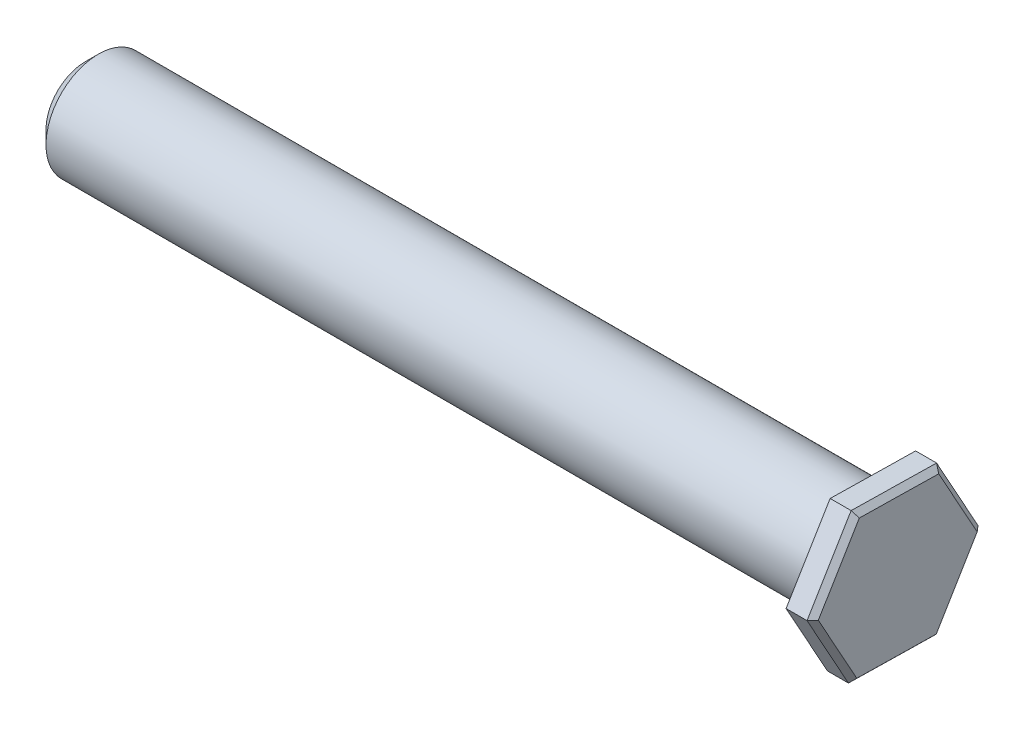
ISO-10303-21;
HEADER;
FILE_DESCRIPTION(('STEP AP214'),'2;1');
FILE_NAME('part.step','',(''),(''),'','','');
FILE_SCHEMA(('AUTOMOTIVE_DESIGN { 1 0 10303 214 1 1 1 1 }'));
ENDSEC;
DATA;
#1=APPLICATION_CONTEXT('core data for automotive mechanical design processes');
#2=APPLICATION_PROTOCOL_DEFINITION('international standard','automotive_design',2000,#1);
#3=PRODUCT_CONTEXT('',#1,'mechanical');
#4=PRODUCT('Part','Part','',(#3));
#5=PRODUCT_RELATED_PRODUCT_CATEGORY('part','',(#4));
#6=PRODUCT_DEFINITION_FORMATION('','',#4);
#7=PRODUCT_DEFINITION_CONTEXT('part definition',#1,'design');
#8=PRODUCT_DEFINITION('design','',#6,#7);
#9=PRODUCT_DEFINITION_SHAPE('','',#8);
#10=(LENGTH_UNIT() NAMED_UNIT(*) SI_UNIT(.MILLI.,.METRE.));
#11=(NAMED_UNIT(*) PLANE_ANGLE_UNIT() SI_UNIT($,.RADIAN.));
#12=(NAMED_UNIT(*) SI_UNIT($,.STERADIAN.) SOLID_ANGLE_UNIT());
#13=UNCERTAINTY_MEASURE_WITH_UNIT(LENGTH_MEASURE(1.E-05),#10,'distance_accuracy_value','');
#14=(GEOMETRIC_REPRESENTATION_CONTEXT(3) GLOBAL_UNCERTAINTY_ASSIGNED_CONTEXT((#13)) GLOBAL_UNIT_ASSIGNED_CONTEXT((#10,
#11,#12)) REPRESENTATION_CONTEXT('',''));
#15=CARTESIAN_POINT('',(0.,0.,0.));
#16=DIRECTION('',(0.,0.,1.));
#17=DIRECTION('',(1.,0.,0.));
#18=AXIS2_PLACEMENT_3D('',#15,#16,#17);
#19=CARTESIAN_POINT('',(150.,0.,0.));
#20=DIRECTION('',(-1.,0.,0.));
#21=DIRECTION('',(0.,0.,1.));
#22=AXIS2_PLACEMENT_3D('',#19,#20,#21);
#23=CYLINDRICAL_SURFACE('',#22,10.);
#24=CARTESIAN_POINT('',(2.50000000000003,0.,0.));
#25=DIRECTION('',(1.,0.,0.));
#26=DIRECTION('',(0.,0.,-1.));
#27=AXIS2_PLACEMENT_3D('',#24,#25,#26);
#28=CIRCLE('',#27,10.);
#29=CARTESIAN_POINT('',(2.50000000000003,0.,-10.));
#30=VERTEX_POINT('',#29);
#31=EDGE_CURVE('E45',#30,#30,#28,.T.);
#32=ORIENTED_EDGE('',*,*,#31,.T.);
#33=EDGE_LOOP('',(#32));
#34=FACE_BOUND('',#33,.T.);
#35=CARTESIAN_POINT('',(150.,0.,0.));
#36=DIRECTION('',(1.,0.,0.));
#37=DIRECTION('',(0.,0.,-1.));
#38=AXIS2_PLACEMENT_3D('',#35,#36,#37);
#39=CIRCLE('',#38,10.);
#40=CARTESIAN_POINT('',(150.,0.,-10.));
#41=VERTEX_POINT('',#40);
#42=EDGE_CURVE('E115',#41,#41,#39,.T.);
#43=ORIENTED_EDGE('',*,*,#42,.F.);
#44=EDGE_LOOP('',(#43));
#45=FACE_BOUND('',#44,.T.);
#46=ADVANCED_FACE('F37',(#34,#45),#23,.T.);
#47=CARTESIAN_POINT('',(0.,0.,0.));
#48=DIRECTION('',(1.,0.,0.));
#49=DIRECTION('',(0.,0.,-1.));
#50=AXIS2_PLACEMENT_3D('',#47,#48,#49);
#51=PLANE('',#50);
#52=CARTESIAN_POINT('',(0.,0.,0.));
#53=DIRECTION('',(1.,0.,0.));
#54=DIRECTION('',(0.,0.,-1.));
#55=AXIS2_PLACEMENT_3D('',#52,#53,#54);
#56=CIRCLE('',#55,7.49999999999998);
#57=CARTESIAN_POINT('',(0.,0.,-7.49999999999998));
#58=VERTEX_POINT('',#57);
#59=EDGE_CURVE('E11',#58,#58,#56,.F.);
#60=ORIENTED_EDGE('',*,*,#59,.T.);
#61=EDGE_LOOP('',(#60));
#62=FACE_BOUND('',#61,.T.);
#63=ADVANCED_FACE('F207',(#62),#51,.F.);
#64=CARTESIAN_POINT('',(155.,14.271842173842,7.8973524301262));
#65=DIRECTION('',(0.,-0.51566572756256,-0.856789856042528));
#66=DIRECTION('',(0.,0.856789856042528,-0.51566572756256));
#67=AXIS2_PLACEMENT_3D('',#64,#65,#66);
#68=PLANE('',#67);
#69=DIRECTION('',(-1.,0.,0.));
#70=VECTOR('',#69,1.);
#71=CARTESIAN_POINT('',(155.,0.296613259792956,16.3084540964124));
#72=LINE('',#71,#70);
#73=CARTESIAN_POINT('',(154.,0.296613259792956,16.3084540964124));
#74=VERTEX_POINT('',#73);
#75=CARTESIAN_POINT('',(150.,0.296613259792956,16.3084540964124));
#76=VERTEX_POINT('',#75);
#77=EDGE_CURVE('E107',#74,#76,#72,.T.);
#78=ORIENTED_EDGE('',*,*,#77,.F.);
#79=DIRECTION('',(0.,0.856789856042528,-0.51566572756256));
#80=VECTOR('',#79,1.);
#81=CARTESIAN_POINT('',(154.,14.271842173842,7.8973524301262));
#82=LINE('',#81,#80);
#83=CARTESIAN_POINT('',(154.,14.271842173842,7.8973524301262));
#84=VERTEX_POINT('',#83);
#85=EDGE_CURVE('E178',#74,#84,#82,.T.);
#86=ORIENTED_EDGE('',*,*,#85,.T.);
#87=DIRECTION('',(-1.,0.,0.));
#88=VECTOR('',#87,1.);
#89=CARTESIAN_POINT('',(155.,14.271842173842,7.8973524301262));
#90=LINE('',#89,#88);
#91=CARTESIAN_POINT('',(150.,14.271842173842,7.8973524301262));
#92=VERTEX_POINT('',#91);
#93=EDGE_CURVE('E129',#84,#92,#90,.T.);
#94=ORIENTED_EDGE('',*,*,#93,.T.);
#95=DIRECTION('',(0.,-0.856789856042528,0.51566572756256));
#96=VECTOR('',#95,1.);
#97=CARTESIAN_POINT('',(150.,14.271842173842,7.8973524301262));
#98=LINE('',#97,#96);
#99=EDGE_CURVE('E122',#92,#76,#98,.T.);
#100=ORIENTED_EDGE('',*,*,#99,.T.);
#101=EDGE_LOOP('',(#78,#86,#94,#100));
#102=FACE_BOUND('',#101,.T.);
#103=ADVANCED_FACE('F127',(#102),#68,.F.);
#104=CARTESIAN_POINT('',(155.,0.296613259792956,16.3084540964124));
#105=DIRECTION('',(0.,0.484168917256361,-0.874974547951426));
#106=DIRECTION('',(0.,0.874974547951426,0.484168917256361));
#107=AXIS2_PLACEMENT_3D('',#104,#105,#106);
#108=PLANE('',#107);
#109=DIRECTION('',(-1.,0.,0.));
#110=VECTOR('',#109,1.);
#111=CARTESIAN_POINT('',(155.,-13.9752289140491,8.41110166628622));
#112=LINE('',#111,#110);
#113=CARTESIAN_POINT('',(154.,-13.9752289140491,8.41110166628622));
#114=VERTEX_POINT('',#113);
#115=CARTESIAN_POINT('',(150.,-13.9752289140491,8.41110166628622));
#116=VERTEX_POINT('',#115);
#117=EDGE_CURVE('E116',#114,#116,#112,.T.);
#118=ORIENTED_EDGE('',*,*,#117,.F.);
#119=DIRECTION('',(0.,0.874974547951426,0.484168917256361));
#120=VECTOR('',#119,1.);
#121=CARTESIAN_POINT('',(154.,0.296613259792956,16.3084540964124));
#122=LINE('',#121,#120);
#123=EDGE_CURVE('E52',#114,#74,#122,.T.);
#124=ORIENTED_EDGE('',*,*,#123,.T.);
#125=ORIENTED_EDGE('',*,*,#77,.T.);
#126=DIRECTION('',(0.,-0.874974547951426,-0.484168917256361));
#127=VECTOR('',#126,1.);
#128=CARTESIAN_POINT('',(150.,0.296613259792956,16.3084540964124));
#129=LINE('',#128,#127);
#130=EDGE_CURVE('E110',#76,#116,#129,.T.);
#131=ORIENTED_EDGE('',*,*,#130,.T.);
#132=EDGE_LOOP('',(#118,#124,#125,#131));
#133=FACE_BOUND('',#132,.T.);
#134=ADVANCED_FACE('F109',(#133),#108,.F.);
#135=CARTESIAN_POINT('',(155.,-13.9752289140491,8.41110166628622));
#136=DIRECTION('',(0.,0.999834644818921,-0.0181846919088983));
#137=DIRECTION('',(0.,0.0181846919088983,0.999834644818921));
#138=AXIS2_PLACEMENT_3D('',#135,#136,#137);
#139=PLANE('',#138);
#140=DIRECTION('',(-1.,0.,0.));
#141=VECTOR('',#140,1.);
#142=CARTESIAN_POINT('',(155.,-14.271842173842,-7.89735243012619));
#143=LINE('',#142,#141);
#144=CARTESIAN_POINT('',(154.,-14.271842173842,-7.89735243012619));
#145=VERTEX_POINT('',#144);
#146=CARTESIAN_POINT('',(150.,-14.271842173842,-7.89735243012619));
#147=VERTEX_POINT('',#146);
#148=EDGE_CURVE('E151',#145,#147,#143,.T.);
#149=ORIENTED_EDGE('',*,*,#148,.F.);
#150=DIRECTION('',(0.,0.0181846919088983,0.999834644818921));
#151=VECTOR('',#150,1.);
#152=CARTESIAN_POINT('',(154.,-13.9752289140491,8.41110166628622));
#153=LINE('',#152,#151);
#154=EDGE_CURVE('E60',#145,#114,#153,.T.);
#155=ORIENTED_EDGE('',*,*,#154,.T.);
#156=ORIENTED_EDGE('',*,*,#117,.T.);
#157=DIRECTION('',(0.,-0.0181846919088983,-0.999834644818921));
#158=VECTOR('',#157,1.);
#159=CARTESIAN_POINT('',(150.,-13.9752289140491,8.41110166628622));
#160=LINE('',#159,#158);
#161=EDGE_CURVE('E125',#116,#147,#160,.T.);
#162=ORIENTED_EDGE('',*,*,#161,.T.);
#163=EDGE_LOOP('',(#149,#155,#156,#162));
#164=FACE_BOUND('',#163,.T.);
#165=ADVANCED_FACE('F275',(#164),#139,.F.);
#166=CARTESIAN_POINT('',(155.,-14.271842173842,-7.89735243012619));
#167=DIRECTION('',(0.,0.51566572756256,0.856789856042528));
#168=DIRECTION('',(0.,-0.856789856042528,0.51566572756256));
#169=AXIS2_PLACEMENT_3D('',#166,#167,#168);
#170=PLANE('',#169);
#171=DIRECTION('',(-1.,0.,0.));
#172=VECTOR('',#171,1.);
#173=CARTESIAN_POINT('',(155.,-0.296613259792948,-16.3084540964124));
#174=LINE('',#173,#172);
#175=CARTESIAN_POINT('',(154.,-0.296613259792948,-16.3084540964124));
#176=VERTEX_POINT('',#175);
#177=CARTESIAN_POINT('',(150.,-0.296613259792948,-16.3084540964124));
#178=VERTEX_POINT('',#177);
#179=EDGE_CURVE('E149',#176,#178,#174,.T.);
#180=ORIENTED_EDGE('',*,*,#179,.F.);
#181=DIRECTION('',(0.,-0.856789856042528,0.51566572756256));
#182=VECTOR('',#181,1.);
#183=CARTESIAN_POINT('',(154.,-14.271842173842,-7.89735243012619));
#184=LINE('',#183,#182);
#185=EDGE_CURVE('E174',#176,#145,#184,.T.);
#186=ORIENTED_EDGE('',*,*,#185,.T.);
#187=ORIENTED_EDGE('',*,*,#148,.T.);
#188=DIRECTION('',(0.,0.856789856042528,-0.51566572756256));
#189=VECTOR('',#188,1.);
#190=CARTESIAN_POINT('',(150.,-14.271842173842,-7.89735243012619));
#191=LINE('',#190,#189);
#192=EDGE_CURVE('E138',#147,#178,#191,.T.);
#193=ORIENTED_EDGE('',*,*,#192,.T.);
#194=EDGE_LOOP('',(#180,#186,#187,#193));
#195=FACE_BOUND('',#194,.T.);
#196=ADVANCED_FACE('F260',(#195),#170,.F.);
#197=CARTESIAN_POINT('',(155.,-0.296613259792948,-16.3084540964124));
#198=DIRECTION('',(0.,-0.484168917256362,0.874974547951426));
#199=DIRECTION('',(0.,-0.874974547951426,-0.484168917256362));
#200=AXIS2_PLACEMENT_3D('',#197,#198,#199);
#201=PLANE('',#200);
#202=DIRECTION('',(-1.,0.,0.));
#203=VECTOR('',#202,1.);
#204=CARTESIAN_POINT('',(155.,13.9752289140491,-8.41110166628621));
#205=LINE('',#204,#203);
#206=CARTESIAN_POINT('',(154.,13.9752289140491,-8.41110166628621));
#207=VERTEX_POINT('',#206);
#208=CARTESIAN_POINT('',(150.,13.9752289140491,-8.41110166628621));
#209=VERTEX_POINT('',#208);
#210=EDGE_CURVE('E147',#207,#209,#205,.T.);
#211=ORIENTED_EDGE('',*,*,#210,.F.);
#212=DIRECTION('',(0.,-0.874974547951426,-0.484168917256362));
#213=VECTOR('',#212,1.);
#214=CARTESIAN_POINT('',(154.,-0.296613259792948,-16.3084540964124));
#215=LINE('',#214,#213);
#216=EDGE_CURVE('E172',#207,#176,#215,.T.);
#217=ORIENTED_EDGE('',*,*,#216,.T.);
#218=ORIENTED_EDGE('',*,*,#179,.T.);
#219=DIRECTION('',(0.,0.874974547951426,0.484168917256362));
#220=VECTOR('',#219,1.);
#221=CARTESIAN_POINT('',(150.,-0.296613259792948,-16.3084540964124));
#222=LINE('',#221,#220);
#223=EDGE_CURVE('E141',#178,#209,#222,.T.);
#224=ORIENTED_EDGE('',*,*,#223,.T.);
#225=EDGE_LOOP('',(#211,#217,#218,#224));
#226=FACE_BOUND('',#225,.T.);
#227=ADVANCED_FACE('F257',(#226),#201,.F.);
#228=CARTESIAN_POINT('',(155.,13.9752289140491,-8.41110166628621));
#229=DIRECTION('',(0.,-0.999834644818921,0.0181846919088982));
#230=DIRECTION('',(0.,-0.0181846919088982,-0.999834644818921));
#231=AXIS2_PLACEMENT_3D('',#228,#229,#230);
#232=PLANE('',#231);
#233=ORIENTED_EDGE('',*,*,#93,.F.);
#234=DIRECTION('',(0.,-0.0181846919088982,-0.999834644818921));
#235=VECTOR('',#234,1.);
#236=CARTESIAN_POINT('',(154.,13.9752289140491,-8.41110166628621));
#237=LINE('',#236,#235);
#238=EDGE_CURVE('E169',#84,#207,#237,.T.);
#239=ORIENTED_EDGE('',*,*,#238,.T.);
#240=ORIENTED_EDGE('',*,*,#210,.T.);
#241=DIRECTION('',(0.,0.0181846919088982,0.999834644818921));
#242=VECTOR('',#241,1.);
#243=CARTESIAN_POINT('',(150.,13.9752289140491,-8.41110166628621));
#244=LINE('',#243,#242);
#245=EDGE_CURVE('E144',#209,#92,#244,.T.);
#246=ORIENTED_EDGE('',*,*,#245,.T.);
#247=EDGE_LOOP('',(#233,#239,#240,#246));
#248=FACE_BOUND('',#247,.T.);
#249=ADVANCED_FACE('F248',(#248),#232,.F.);
#250=CARTESIAN_POINT('',(155.,0.,0.));
#251=DIRECTION('',(1.,0.,0.));
#252=DIRECTION('',(0.,0.,-1.));
#253=AXIS2_PLACEMENT_3D('',#250,#251,#252);
#254=PLANE('',#253);
#255=DIRECTION('',(0.,0.874974547951426,0.484168917256362));
#256=VECTOR('',#255,1.);
#257=CARTESIAN_POINT('',(155.,13.4910599967927,-7.53612711833477));
#258=LINE('',#257,#256);
#259=CARTESIAN_POINT('',(155.,-0.275615386255479,-15.1539444937498));
#260=VERTEX_POINT('',#259);
#261=CARTESIAN_POINT('',(155.,12.9858932059989,-7.81566217304598));
#262=VERTEX_POINT('',#261);
#263=EDGE_CURVE('E164',#260,#262,#258,.T.);
#264=ORIENTED_EDGE('',*,*,#263,.T.);
#265=DIRECTION('',(0.,0.0181846919088982,0.999834644818921));
#266=VECTOR('',#265,1.);
#267=CARTESIAN_POINT('',(155.,13.2720075290231,7.9155371220351));
#268=LINE('',#267,#266);
#269=CARTESIAN_POINT('',(155.,13.2615085922544,7.33828232070377));
#270=VERTEX_POINT('',#269);
#271=EDGE_CURVE('E166',#262,#270,#268,.T.);
#272=ORIENTED_EDGE('',*,*,#271,.T.);
#273=DIRECTION('',(0.,-0.856789856042528,0.51566572756256));
#274=VECTOR('',#273,1.);
#275=CARTESIAN_POINT('',(155.,-0.219052467769612,15.4516642403699));
#276=LINE('',#275,#274);
#277=CARTESIAN_POINT('',(155.,0.275615386255487,15.1539444937498));
#278=VERTEX_POINT('',#277);
#279=EDGE_CURVE('E156',#270,#278,#276,.T.);
#280=ORIENTED_EDGE('',*,*,#279,.T.);
#281=DIRECTION('',(0.,-0.874974547951426,-0.484168917256361));
#282=VECTOR('',#281,1.);
#283=CARTESIAN_POINT('',(155.,-13.4910599967927,7.53612711833478));
#284=LINE('',#283,#282);
#285=CARTESIAN_POINT('',(155.,-12.9858932059989,7.81566217304599));
#286=VERTEX_POINT('',#285);
#287=EDGE_CURVE('E158',#278,#286,#284,.T.);
#288=ORIENTED_EDGE('',*,*,#287,.T.);
#289=DIRECTION('',(0.,-0.0181846919088983,-0.999834644818921));
#290=VECTOR('',#289,1.);
#291=CARTESIAN_POINT('',(155.,-13.2720075290231,-7.91553712203509));
#292=LINE('',#291,#290);
#293=CARTESIAN_POINT('',(155.,-13.2615085922544,-7.33828232070376));
#294=VERTEX_POINT('',#293);
#295=EDGE_CURVE('E160',#286,#294,#292,.T.);
#296=ORIENTED_EDGE('',*,*,#295,.T.);
#297=DIRECTION('',(0.,0.856789856042528,-0.51566572756256));
#298=VECTOR('',#297,1.);
#299=CARTESIAN_POINT('',(155.,0.219052467769621,-15.4516642403699));
#300=LINE('',#299,#298);
#301=EDGE_CURVE('E162',#294,#260,#300,.T.);
#302=ORIENTED_EDGE('',*,*,#301,.T.);
#303=EDGE_LOOP('',(#264,#272,#280,#288,#296,#302));
#304=FACE_BOUND('',#303,.T.);
#305=ADVANCED_FACE('F236',(#304),#254,.T.);
#306=CARTESIAN_POINT('',(150.,0.,0.));
#307=DIRECTION('',(1.,0.,0.));
#308=DIRECTION('',(0.,0.,-1.));
#309=AXIS2_PLACEMENT_3D('',#306,#307,#308);
#310=PLANE('',#309);
#311=ORIENTED_EDGE('',*,*,#42,.T.);
#312=EDGE_LOOP('',(#311));
#313=FACE_BOUND('',#312,.T.);
#314=ORIENTED_EDGE('',*,*,#99,.F.);
#315=ORIENTED_EDGE('',*,*,#245,.F.);
#316=ORIENTED_EDGE('',*,*,#223,.F.);
#317=ORIENTED_EDGE('',*,*,#192,.F.);
#318=ORIENTED_EDGE('',*,*,#161,.F.);
#319=ORIENTED_EDGE('',*,*,#130,.F.);
#320=EDGE_LOOP('',(#314,#315,#316,#317,#318,#319));
#321=FACE_BOUND('',#320,.T.);
#322=ADVANCED_FACE('F120',(#313,#321),#310,.F.);
#323=CARTESIAN_POINT('',(155.,-13.1237008991266,0.238689926171113));
#324=DIRECTION('',(0.707106781186542,-0.706989857416708,0.0128585189625702));
#325=DIRECTION('',(0.,0.0181846919088983,0.999834644818921));
#326=AXIS2_PLACEMENT_3D('',#323,#324,#325);
#327=PLANE('',#326);
#328=DIRECTION('',(0.654653670707983,0.647672252837527,-0.389806649934203));
#329=VECTOR('',#328,1.);
#330=CARTESIAN_POINT('',(156.875124475708,-11.1307656051419,6.69913900546801));
#331=LINE('',#330,#329);
#332=EDGE_CURVE('E134',#114,#286,#331,.T.);
#333=ORIENTED_EDGE('',*,*,#332,.F.);
#334=ORIENTED_EDGE('',*,*,#154,.F.);
#335=DIRECTION('',(0.654653670707982,0.66141858782589,0.365997299316497));
#336=VECTOR('',#335,1.);
#337=CARTESIAN_POINT('',(156.875124475708,-11.3670073647895,-6.28995627488894));
#338=LINE('',#337,#336);
#339=EDGE_CURVE('E131',#294,#145,#338,.F.);
#340=ORIENTED_EDGE('',*,*,#339,.F.);
#341=ORIENTED_EDGE('',*,*,#295,.F.);
#342=EDGE_LOOP('',(#333,#334,#340,#341));
#343=FACE_BOUND('',#342,.T.);
#344=ADVANCED_FACE('F229',(#343),#327,.T.);
#345=CARTESIAN_POINT('',(155.,-6.76856198925491,-11.2461134072268));
#346=DIRECTION('',(0.707106781186543,-0.364630732784983,-0.605841917259521));
#347=DIRECTION('',(0.,-0.856789856042528,0.51566572756256));
#348=AXIS2_PLACEMENT_3D('',#345,#346,#347);
#349=PLANE('',#348);
#350=ORIENTED_EDGE('',*,*,#339,.T.);
#351=ORIENTED_EDGE('',*,*,#185,.F.);
#352=DIRECTION('',(0.654653670707982,0.0137463349883648,0.755803949250699));
#353=VECTOR('',#352,1.);
#354=CARTESIAN_POINT('',(156.875124475708,-0.23624175964755,-12.989095280357));
#355=LINE('',#354,#353);
#356=EDGE_CURVE('E187',#260,#176,#355,.F.);
#357=ORIENTED_EDGE('',*,*,#356,.F.);
#358=ORIENTED_EDGE('',*,*,#301,.F.);
#359=EDGE_LOOP('',(#350,#351,#357,#358));
#360=FACE_BOUND('',#359,.T.);
#361=ADVANCED_FACE('F226',(#360),#349,.T.);
#362=CARTESIAN_POINT('',(155.,-6.35513890987169,11.4848033333979));
#363=DIRECTION('',(0.707106781186542,-0.342359124631724,0.618700436222092));
#364=DIRECTION('',(0.,0.874974547951426,0.484168917256361));
#365=AXIS2_PLACEMENT_3D('',#362,#363,#364);
#366=PLANE('',#365);
#367=ORIENTED_EDGE('',*,*,#332,.T.);
#368=ORIENTED_EDGE('',*,*,#287,.F.);
#369=DIRECTION('',(0.654653670707983,-0.0137463349883652,-0.755803949250698));
#370=VECTOR('',#369,1.);
#371=CARTESIAN_POINT('',(156.875124475708,0.236241759647556,12.989095280357));
#372=LINE('',#371,#370);
#373=EDGE_CURVE('E184',#74,#278,#372,.T.);
#374=ORIENTED_EDGE('',*,*,#373,.F.);
#375=ORIENTED_EDGE('',*,*,#123,.F.);
#376=EDGE_LOOP('',(#367,#368,#374,#375));
#377=FACE_BOUND('',#376,.T.);
#378=ADVANCED_FACE('F222',(#377),#366,.T.);
#379=CARTESIAN_POINT('',(155.,6.35513890987169,-11.4848033333979));
#380=DIRECTION('',(0.707106781186543,0.342359124631724,-0.618700436222092));
#381=DIRECTION('',(0.,-0.874974547951426,-0.484168917256362));
#382=AXIS2_PLACEMENT_3D('',#379,#380,#381);
#383=PLANE('',#382);
#384=ORIENTED_EDGE('',*,*,#356,.T.);
#385=ORIENTED_EDGE('',*,*,#216,.F.);
#386=DIRECTION('',(0.654653670707983,-0.647672252837527,0.389806649934204));
#387=VECTOR('',#386,1.);
#388=CARTESIAN_POINT('',(156.875124475708,11.1307656051419,-6.699139005468));
#389=LINE('',#388,#387);
#390=EDGE_CURVE('E182',#262,#207,#389,.F.);
#391=ORIENTED_EDGE('',*,*,#390,.F.);
#392=ORIENTED_EDGE('',*,*,#263,.F.);
#393=EDGE_LOOP('',(#384,#385,#391,#392));
#394=FACE_BOUND('',#393,.T.);
#395=ADVANCED_FACE('F218',(#394),#383,.T.);
#396=CARTESIAN_POINT('',(155.,6.76856198925492,11.2461134072268));
#397=DIRECTION('',(0.707106781186543,0.364630732784983,0.605841917259522));
#398=DIRECTION('',(0.,0.856789856042528,-0.51566572756256));
#399=AXIS2_PLACEMENT_3D('',#396,#397,#398);
#400=PLANE('',#399);
#401=ORIENTED_EDGE('',*,*,#373,.T.);
#402=ORIENTED_EDGE('',*,*,#279,.F.);
#403=DIRECTION('',(-0.654653670707983,0.66141858782589,0.365997299316497));
#404=VECTOR('',#403,1.);
#405=CARTESIAN_POINT('',(156.875124475708,11.3670073647895,6.28995627488896));
#406=LINE('',#405,#404);
#407=EDGE_CURVE('E180',#84,#270,#406,.F.);
#408=ORIENTED_EDGE('',*,*,#407,.F.);
#409=ORIENTED_EDGE('',*,*,#85,.F.);
#410=EDGE_LOOP('',(#401,#402,#408,#409));
#411=FACE_BOUND('',#410,.T.);
#412=ADVANCED_FACE('F202',(#411),#400,.T.);
#413=CARTESIAN_POINT('',(155.,13.1237008991266,-0.238689926171112));
#414=DIRECTION('',(0.707106781186542,0.706989857416708,-0.0128585189625702));
#415=DIRECTION('',(0.,-0.0181846919088982,-0.999834644818921));
#416=AXIS2_PLACEMENT_3D('',#413,#414,#415);
#417=PLANE('',#416);
#418=ORIENTED_EDGE('',*,*,#390,.T.);
#419=ORIENTED_EDGE('',*,*,#238,.F.);
#420=ORIENTED_EDGE('',*,*,#407,.T.);
#421=ORIENTED_EDGE('',*,*,#271,.F.);
#422=EDGE_LOOP('',(#418,#419,#420,#421));
#423=FACE_BOUND('',#422,.T.);
#424=ADVANCED_FACE('F197',(#423),#417,.T.);
#425=CARTESIAN_POINT('',(2.50000000000003,0.,0.));
#426=DIRECTION('',(1.,0.,0.));
#427=DIRECTION('',(0.,0.,-1.));
#428=AXIS2_PLACEMENT_3D('',#425,#426,#427);
#429=CONICAL_SURFACE('',#428,10.,0.785398163397446);
#430=ORIENTED_EDGE('',*,*,#59,.F.);
#431=EDGE_LOOP('',(#430));
#432=FACE_BOUND('',#431,.T.);
#433=ORIENTED_EDGE('',*,*,#31,.F.);
#434=EDGE_LOOP('',(#433));
#435=FACE_BOUND('',#434,.T.);
#436=ADVANCED_FACE('F39',(#432,#435),#429,.T.);
#437=CLOSED_SHELL('',(#46,#63,#103,#134,#165,#196,#227,#249,#305,#322,#344,#361,#378,#395,#412,
#424,#436));
#438=MANIFOLD_SOLID_BREP('B2',#437);
#439=ADVANCED_BREP_SHAPE_REPRESENTATION('',(#18,#438),#14);
#440=SHAPE_DEFINITION_REPRESENTATION(#9,#439);
ENDSEC;
END-ISO-10303-21;
